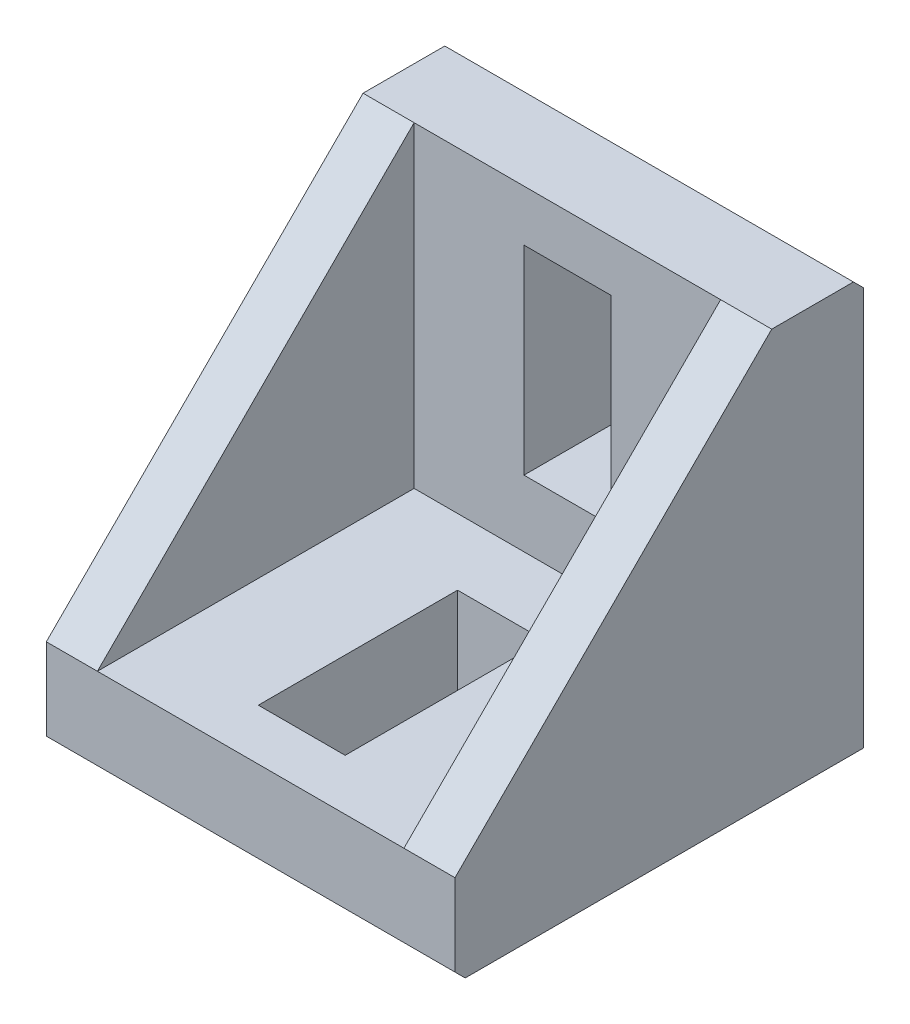
ISO-10303-21;
HEADER;
FILE_DESCRIPTION(('STEP AP214'),'2;1');
FILE_NAME('part.step','',(''),(''),'','','');
FILE_SCHEMA(('AUTOMOTIVE_DESIGN { 1 0 10303 214 1 1 1 1 }'));
ENDSEC;
DATA;
#1=APPLICATION_CONTEXT('core data for automotive mechanical design processes');
#2=APPLICATION_PROTOCOL_DEFINITION('international standard','automotive_design',2000,#1);
#3=PRODUCT_CONTEXT('',#1,'mechanical');
#4=PRODUCT('Part','Part','',(#3));
#5=PRODUCT_RELATED_PRODUCT_CATEGORY('part','',(#4));
#6=PRODUCT_DEFINITION_FORMATION('','',#4);
#7=PRODUCT_DEFINITION_CONTEXT('part definition',#1,'design');
#8=PRODUCT_DEFINITION('design','',#6,#7);
#9=PRODUCT_DEFINITION_SHAPE('','',#8);
#10=(LENGTH_UNIT() NAMED_UNIT(*) SI_UNIT(.MILLI.,.METRE.));
#11=(NAMED_UNIT(*) PLANE_ANGLE_UNIT() SI_UNIT($,.RADIAN.));
#12=(NAMED_UNIT(*) SI_UNIT($,.STERADIAN.) SOLID_ANGLE_UNIT());
#13=UNCERTAINTY_MEASURE_WITH_UNIT(LENGTH_MEASURE(1.E-05),#10,'distance_accuracy_value','');
#14=(GEOMETRIC_REPRESENTATION_CONTEXT(3) GLOBAL_UNCERTAINTY_ASSIGNED_CONTEXT((#13)) GLOBAL_UNIT_ASSIGNED_CONTEXT((#10,
#11,#12)) REPRESENTATION_CONTEXT('',''));
#15=CARTESIAN_POINT('',(0.,0.,0.));
#16=DIRECTION('',(0.,0.,1.));
#17=DIRECTION('',(1.,0.,0.));
#18=AXIS2_PLACEMENT_3D('',#15,#16,#17);
#19=CARTESIAN_POINT('',(0.,9.,0.));
#20=DIRECTION('',(0.,1.,0.));
#21=DIRECTION('',(0.,0.,1.));
#22=AXIS2_PLACEMENT_3D('',#19,#20,#21);
#23=PLANE('',#22);
#24=DIRECTION('',(0.,0.,-1.));
#25=VECTOR('',#24,1.);
#26=CARTESIAN_POINT('',(4.25,9.,-4.5));
#27=LINE('',#26,#25);
#28=CARTESIAN_POINT('',(4.25,9.,15.));
#29=VERTEX_POINT('',#28);
#30=CARTESIAN_POINT('',(4.25,9.,-4.5));
#31=VERTEX_POINT('',#30);
#32=EDGE_CURVE('E321',#29,#31,#27,.T.);
#33=ORIENTED_EDGE('',*,*,#32,.F.);
#34=DIRECTION('',(1.,0.,0.));
#35=VECTOR('',#34,1.);
#36=CARTESIAN_POINT('',(-4.25,9.,15.));
#37=LINE('',#36,#35);
#38=CARTESIAN_POINT('',(-4.25,9.,15.));
#39=VERTEX_POINT('',#38);
#40=EDGE_CURVE('E336',#39,#29,#37,.T.);
#41=ORIENTED_EDGE('',*,*,#40,.F.);
#42=DIRECTION('',(0.,0.,1.));
#43=VECTOR('',#42,1.);
#44=CARTESIAN_POINT('',(-4.25,9.,-4.5));
#45=LINE('',#44,#43);
#46=CARTESIAN_POINT('',(-4.25,9.,-4.5));
#47=VERTEX_POINT('',#46);
#48=EDGE_CURVE('E355',#47,#39,#45,.T.);
#49=ORIENTED_EDGE('',*,*,#48,.F.);
#50=DIRECTION('',(-1.,0.,0.));
#51=VECTOR('',#50,1.);
#52=CARTESIAN_POINT('',(-4.25,9.,-4.5));
#53=LINE('',#52,#51);
#54=EDGE_CURVE('E351',#31,#47,#53,.T.);
#55=ORIENTED_EDGE('',*,*,#54,.F.);
#56=EDGE_LOOP('',(#33,#41,#49,#55));
#57=FACE_BOUND('',#56,.T.);
#58=DIRECTION('',(1.,0.,0.));
#59=VECTOR('',#58,1.);
#60=CARTESIAN_POINT('',(-20.,9.,20.));
#61=LINE('',#60,#59);
#62=CARTESIAN_POINT('',(-15.,9.,20.));
#63=VERTEX_POINT('',#62);
#64=CARTESIAN_POINT('',(15.,9.,20.));
#65=VERTEX_POINT('',#64);
#66=EDGE_CURVE('E182',#63,#65,#61,.T.);
#67=ORIENTED_EDGE('',*,*,#66,.T.);
#68=DIRECTION('',(0.,0.,-1.));
#69=VECTOR('',#68,1.);
#70=CARTESIAN_POINT('',(15.,9.,-11.));
#71=LINE('',#70,#69);
#72=CARTESIAN_POINT('',(15.,9.,-11.));
#73=VERTEX_POINT('',#72);
#74=EDGE_CURVE('E167',#65,#73,#71,.T.);
#75=ORIENTED_EDGE('',*,*,#74,.T.);
#76=DIRECTION('',(1.,0.,0.));
#77=VECTOR('',#76,1.);
#78=CARTESIAN_POINT('',(-20.,9.,-11.));
#79=LINE('',#78,#77);
#80=CARTESIAN_POINT('',(-15.,9.,-11.));
#81=VERTEX_POINT('',#80);
#82=EDGE_CURVE('E180',#81,#73,#79,.T.);
#83=ORIENTED_EDGE('',*,*,#82,.F.);
#84=DIRECTION('',(0.,0.,1.));
#85=VECTOR('',#84,1.);
#86=CARTESIAN_POINT('',(-15.,9.,20.));
#87=LINE('',#86,#85);
#88=EDGE_CURVE('E277',#81,#63,#87,.T.);
#89=ORIENTED_EDGE('',*,*,#88,.T.);
#90=EDGE_LOOP('',(#67,#75,#83,#89));
#91=FACE_BOUND('',#90,.T.);
#92=ADVANCED_FACE('F39',(#57,#91),#23,.T.);
#93=CARTESIAN_POINT('',(-20.,40.,-11.));
#94=DIRECTION('',(0.,0.,-1.));
#95=DIRECTION('',(-1.,0.,0.));
#96=AXIS2_PLACEMENT_3D('',#93,#94,#95);
#97=PLANE('',#96);
#98=DIRECTION('',(-1.,0.,0.));
#99=VECTOR('',#98,1.);
#100=CARTESIAN_POINT('',(-4.25000000000001,35.,-11.));
#101=LINE('',#100,#99);
#102=CARTESIAN_POINT('',(4.24999999999999,35.,-11.));
#103=VERTEX_POINT('',#102);
#104=CARTESIAN_POINT('',(-4.25000000000001,35.,-11.));
#105=VERTEX_POINT('',#104);
#106=EDGE_CURVE('E307',#103,#105,#101,.T.);
#107=ORIENTED_EDGE('',*,*,#106,.F.);
#108=DIRECTION('',(0.,1.,0.));
#109=VECTOR('',#108,1.);
#110=CARTESIAN_POINT('',(4.25,15.5,-11.));
#111=LINE('',#110,#109);
#112=CARTESIAN_POINT('',(4.25,15.5,-11.));
#113=VERTEX_POINT('',#112);
#114=EDGE_CURVE('E283',#113,#103,#111,.T.);
#115=ORIENTED_EDGE('',*,*,#114,.F.);
#116=DIRECTION('',(1.,0.,0.));
#117=VECTOR('',#116,1.);
#118=CARTESIAN_POINT('',(-4.25,15.5,-11.));
#119=LINE('',#118,#117);
#120=CARTESIAN_POINT('',(-4.25,15.5,-11.));
#121=VERTEX_POINT('',#120);
#122=EDGE_CURVE('E292',#121,#113,#119,.T.);
#123=ORIENTED_EDGE('',*,*,#122,.F.);
#124=DIRECTION('',(0.,-1.,0.));
#125=VECTOR('',#124,1.);
#126=CARTESIAN_POINT('',(-4.25,15.5,-11.));
#127=LINE('',#126,#125);
#128=EDGE_CURVE('E311',#105,#121,#127,.T.);
#129=ORIENTED_EDGE('',*,*,#128,.F.);
#130=EDGE_LOOP('',(#107,#115,#123,#129));
#131=FACE_BOUND('',#130,.T.);
#132=DIRECTION('',(0.,1.,0.));
#133=VECTOR('',#132,1.);
#134=CARTESIAN_POINT('',(15.,40.,-11.));
#135=LINE('',#134,#133);
#136=CARTESIAN_POINT('',(15.,40.,-11.));
#137=VERTEX_POINT('',#136);
#138=EDGE_CURVE('E164',#73,#137,#135,.T.);
#139=ORIENTED_EDGE('',*,*,#138,.T.);
#140=DIRECTION('',(1.,0.,0.));
#141=VECTOR('',#140,1.);
#142=CARTESIAN_POINT('',(-20.,40.,-11.));
#143=LINE('',#142,#141);
#144=CARTESIAN_POINT('',(-15.,40.,-11.));
#145=VERTEX_POINT('',#144);
#146=EDGE_CURVE('E196',#145,#137,#143,.T.);
#147=ORIENTED_EDGE('',*,*,#146,.F.);
#148=DIRECTION('',(0.,-1.,0.));
#149=VECTOR('',#148,1.);
#150=CARTESIAN_POINT('',(-15.,9.,-11.));
#151=LINE('',#150,#149);
#152=EDGE_CURVE('E189',#145,#81,#151,.T.);
#153=ORIENTED_EDGE('',*,*,#152,.T.);
#154=ORIENTED_EDGE('',*,*,#82,.T.);
#155=EDGE_LOOP('',(#139,#147,#153,#154));
#156=FACE_BOUND('',#155,.T.);
#157=ADVANCED_FACE('F187',(#131,#156),#97,.F.);
#158=CARTESIAN_POINT('',(20.,9.,-20.));
#159=DIRECTION('',(-1.,0.,0.));
#160=DIRECTION('',(0.,0.,1.));
#161=AXIS2_PLACEMENT_3D('',#158,#159,#160);
#162=PLANE('',#161);
#163=DIRECTION('',(0.,-1.,0.));
#164=VECTOR('',#163,1.);
#165=CARTESIAN_POINT('',(20.,9.,-20.));
#166=LINE('',#165,#164);
#167=CARTESIAN_POINT('',(20.,39.,-20.));
#168=VERTEX_POINT('',#167);
#169=CARTESIAN_POINT('',(20.,0.,-20.));
#170=VERTEX_POINT('',#169);
#171=EDGE_CURVE('E228',#168,#170,#166,.T.);
#172=ORIENTED_EDGE('',*,*,#171,.F.);
#173=DIRECTION('',(0.,0.70710678118655,0.707106781186545));
#174=VECTOR('',#173,1.);
#175=CARTESIAN_POINT('',(20.,40.,-19.));
#176=LINE('',#175,#174);
#177=CARTESIAN_POINT('',(20.,40.,-19.));
#178=VERTEX_POINT('',#177);
#179=EDGE_CURVE('E247',#168,#178,#176,.T.);
#180=ORIENTED_EDGE('',*,*,#179,.T.);
#181=DIRECTION('',(0.,0.,-1.));
#182=VECTOR('',#181,1.);
#183=CARTESIAN_POINT('',(20.,40.,-20.));
#184=LINE('',#183,#182);
#185=CARTESIAN_POINT('',(20.,40.,-11.));
#186=VERTEX_POINT('',#185);
#187=EDGE_CURVE('E202',#186,#178,#184,.T.);
#188=ORIENTED_EDGE('',*,*,#187,.F.);
#189=DIRECTION('',(0.,-0.707106781186548,0.707106781186548));
#190=VECTOR('',#189,1.);
#191=CARTESIAN_POINT('',(20.,9.,20.));
#192=LINE('',#191,#190);
#193=CARTESIAN_POINT('',(20.,9.,20.));
#194=VERTEX_POINT('',#193);
#195=EDGE_CURVE('E184',#186,#194,#192,.T.);
#196=ORIENTED_EDGE('',*,*,#195,.T.);
#197=DIRECTION('',(0.,-1.,0.));
#198=VECTOR('',#197,1.);
#199=CARTESIAN_POINT('',(20.,9.,20.));
#200=LINE('',#199,#198);
#201=CARTESIAN_POINT('',(20.,1.,20.));
#202=VERTEX_POINT('',#201);
#203=EDGE_CURVE('E207',#194,#202,#200,.T.);
#204=ORIENTED_EDGE('',*,*,#203,.T.);
#205=DIRECTION('',(0.,0.707106781186545,0.70710678118655));
#206=VECTOR('',#205,1.);
#207=CARTESIAN_POINT('',(20.,1.,20.));
#208=LINE('',#207,#206);
#209=CARTESIAN_POINT('',(20.,0.,19.));
#210=VERTEX_POINT('',#209);
#211=EDGE_CURVE('E55',#202,#210,#208,.F.);
#212=ORIENTED_EDGE('',*,*,#211,.T.);
#213=DIRECTION('',(0.,0.,-1.));
#214=VECTOR('',#213,1.);
#215=CARTESIAN_POINT('',(20.,0.,-20.));
#216=LINE('',#215,#214);
#217=EDGE_CURVE('E208',#210,#170,#216,.T.);
#218=ORIENTED_EDGE('',*,*,#217,.T.);
#219=EDGE_LOOP('',(#172,#180,#188,#196,#204,#212,#218));
#220=FACE_BOUND('',#219,.T.);
#221=ADVANCED_FACE('F259',(#220),#162,.F.);
#222=CARTESIAN_POINT('',(-20.,9.,-20.));
#223=DIRECTION('',(0.,0.,1.));
#224=DIRECTION('',(1.,0.,0.));
#225=AXIS2_PLACEMENT_3D('',#222,#223,#224);
#226=PLANE('',#225);
#227=DIRECTION('',(1.,0.,0.));
#228=VECTOR('',#227,1.);
#229=CARTESIAN_POINT('',(-4.25,15.5,-20.));
#230=LINE('',#229,#228);
#231=CARTESIAN_POINT('',(-4.25,15.5,-20.));
#232=VERTEX_POINT('',#231);
#233=CARTESIAN_POINT('',(4.25,15.5,-20.));
#234=VERTEX_POINT('',#233);
#235=EDGE_CURVE('E300',#232,#234,#230,.T.);
#236=ORIENTED_EDGE('',*,*,#235,.T.);
#237=DIRECTION('',(0.,1.,0.));
#238=VECTOR('',#237,1.);
#239=CARTESIAN_POINT('',(4.25,15.5,-20.));
#240=LINE('',#239,#238);
#241=CARTESIAN_POINT('',(4.24999999999999,35.,-20.));
#242=VERTEX_POINT('',#241);
#243=EDGE_CURVE('E287',#234,#242,#240,.T.);
#244=ORIENTED_EDGE('',*,*,#243,.T.);
#245=DIRECTION('',(-1.,0.,0.));
#246=VECTOR('',#245,1.);
#247=CARTESIAN_POINT('',(-4.25000000000001,35.,-20.));
#248=LINE('',#247,#246);
#249=CARTESIAN_POINT('',(-4.25000000000001,35.,-20.));
#250=VERTEX_POINT('',#249);
#251=EDGE_CURVE('E291',#242,#250,#248,.T.);
#252=ORIENTED_EDGE('',*,*,#251,.T.);
#253=DIRECTION('',(0.,-1.,0.));
#254=VECTOR('',#253,1.);
#255=CARTESIAN_POINT('',(-4.25,15.5,-20.));
#256=LINE('',#255,#254);
#257=EDGE_CURVE('E296',#250,#232,#256,.T.);
#258=ORIENTED_EDGE('',*,*,#257,.T.);
#259=EDGE_LOOP('',(#236,#244,#252,#258));
#260=FACE_BOUND('',#259,.T.);
#261=DIRECTION('',(0.,-1.,0.));
#262=VECTOR('',#261,1.);
#263=CARTESIAN_POINT('',(-20.,9.,-20.));
#264=LINE('',#263,#262);
#265=CARTESIAN_POINT('',(-20.,39.,-20.));
#266=VERTEX_POINT('',#265);
#267=CARTESIAN_POINT('',(-20.,0.,-20.));
#268=VERTEX_POINT('',#267);
#269=EDGE_CURVE('E225',#266,#268,#264,.T.);
#270=ORIENTED_EDGE('',*,*,#269,.F.);
#271=DIRECTION('',(1.,0.,0.));
#272=VECTOR('',#271,1.);
#273=CARTESIAN_POINT('',(20.,39.,-20.));
#274=LINE('',#273,#272);
#275=EDGE_CURVE('E242',#266,#168,#274,.T.);
#276=ORIENTED_EDGE('',*,*,#275,.T.);
#277=ORIENTED_EDGE('',*,*,#171,.T.);
#278=DIRECTION('',(-1.,0.,0.));
#279=VECTOR('',#278,1.);
#280=CARTESIAN_POINT('',(-20.,0.,-20.));
#281=LINE('',#280,#279);
#282=EDGE_CURVE('E211',#170,#268,#281,.T.);
#283=ORIENTED_EDGE('',*,*,#282,.T.);
#284=EDGE_LOOP('',(#270,#276,#277,#283));
#285=FACE_BOUND('',#284,.T.);
#286=ADVANCED_FACE('F415',(#260,#285),#226,.F.);
#287=CARTESIAN_POINT('',(-20.,9.,-20.));
#288=DIRECTION('',(1.,0.,0.));
#289=DIRECTION('',(0.,0.,-1.));
#290=AXIS2_PLACEMENT_3D('',#287,#288,#289);
#291=PLANE('',#290);
#292=DIRECTION('',(0.,0.,1.));
#293=VECTOR('',#292,1.);
#294=CARTESIAN_POINT('',(-20.,40.,-20.));
#295=LINE('',#294,#293);
#296=CARTESIAN_POINT('',(-20.,40.,-19.));
#297=VERTEX_POINT('',#296);
#298=CARTESIAN_POINT('',(-20.,40.,-11.));
#299=VERTEX_POINT('',#298);
#300=EDGE_CURVE('E191',#297,#299,#295,.T.);
#301=ORIENTED_EDGE('',*,*,#300,.F.);
#302=DIRECTION('',(0.,-0.70710678118655,-0.707106781186545));
#303=VECTOR('',#302,1.);
#304=CARTESIAN_POINT('',(-20.,40.,-19.));
#305=LINE('',#304,#303);
#306=EDGE_CURVE('E239',#297,#266,#305,.T.);
#307=ORIENTED_EDGE('',*,*,#306,.T.);
#308=ORIENTED_EDGE('',*,*,#269,.T.);
#309=DIRECTION('',(0.,0.,1.));
#310=VECTOR('',#309,1.);
#311=CARTESIAN_POINT('',(-20.,0.,-20.));
#312=LINE('',#311,#310);
#313=CARTESIAN_POINT('',(-20.,0.,19.));
#314=VERTEX_POINT('',#313);
#315=EDGE_CURVE('E215',#268,#314,#312,.T.);
#316=ORIENTED_EDGE('',*,*,#315,.T.);
#317=DIRECTION('',(0.,-0.707106781186545,-0.70710678118655));
#318=VECTOR('',#317,1.);
#319=CARTESIAN_POINT('',(-20.,1.,20.));
#320=LINE('',#319,#318);
#321=CARTESIAN_POINT('',(-20.,1.,20.));
#322=VERTEX_POINT('',#321);
#323=EDGE_CURVE('E236',#314,#322,#320,.F.);
#324=ORIENTED_EDGE('',*,*,#323,.T.);
#325=DIRECTION('',(0.,-1.,0.));
#326=VECTOR('',#325,1.);
#327=CARTESIAN_POINT('',(-20.,9.,20.));
#328=LINE('',#327,#326);
#329=CARTESIAN_POINT('',(-20.,9.,20.));
#330=VERTEX_POINT('',#329);
#331=EDGE_CURVE('E221',#330,#322,#328,.T.);
#332=ORIENTED_EDGE('',*,*,#331,.F.);
#333=DIRECTION('',(0.,0.707106781186548,-0.707106781186548));
#334=VECTOR('',#333,1.);
#335=CARTESIAN_POINT('',(-20.,40.,-11.));
#336=LINE('',#335,#334);
#337=EDGE_CURVE('E271',#330,#299,#336,.T.);
#338=ORIENTED_EDGE('',*,*,#337,.T.);
#339=EDGE_LOOP('',(#301,#307,#308,#316,#324,#332,#338));
#340=FACE_BOUND('',#339,.T.);
#341=ADVANCED_FACE('F412',(#340),#291,.F.);
#342=CARTESIAN_POINT('',(-20.,9.,20.));
#343=DIRECTION('',(0.,0.,-1.));
#344=DIRECTION('',(-1.,0.,0.));
#345=AXIS2_PLACEMENT_3D('',#342,#343,#344);
#346=PLANE('',#345);
#347=ORIENTED_EDGE('',*,*,#331,.T.);
#348=DIRECTION('',(1.,0.,0.));
#349=VECTOR('',#348,1.);
#350=CARTESIAN_POINT('',(-20.,1.,20.));
#351=LINE('',#350,#349);
#352=EDGE_CURVE('E48',#322,#202,#351,.T.);
#353=ORIENTED_EDGE('',*,*,#352,.T.);
#354=ORIENTED_EDGE('',*,*,#203,.F.);
#355=DIRECTION('',(1.,0.,0.));
#356=VECTOR('',#355,1.);
#357=CARTESIAN_POINT('',(15.,9.,20.));
#358=LINE('',#357,#356);
#359=EDGE_CURVE('E268',#65,#194,#358,.T.);
#360=ORIENTED_EDGE('',*,*,#359,.F.);
#361=ORIENTED_EDGE('',*,*,#66,.F.);
#362=EDGE_CURVE('E204',#330,#63,#61,.T.);
#363=ORIENTED_EDGE('',*,*,#362,.F.);
#364=EDGE_LOOP('',(#347,#353,#354,#360,#361,#363));
#365=FACE_BOUND('',#364,.T.);
#366=ADVANCED_FACE('F252',(#365),#346,.F.);
#367=CARTESIAN_POINT('',(0.,0.,0.));
#368=DIRECTION('',(0.,1.,0.));
#369=DIRECTION('',(0.,0.,1.));
#370=AXIS2_PLACEMENT_3D('',#367,#368,#369);
#371=PLANE('',#370);
#372=DIRECTION('',(1.,0.,0.));
#373=VECTOR('',#372,1.);
#374=CARTESIAN_POINT('',(-4.25,0.,15.));
#375=LINE('',#374,#373);
#376=CARTESIAN_POINT('',(-4.25,0.,15.));
#377=VERTEX_POINT('',#376);
#378=CARTESIAN_POINT('',(4.25,0.,15.));
#379=VERTEX_POINT('',#378);
#380=EDGE_CURVE('E344',#377,#379,#375,.T.);
#381=ORIENTED_EDGE('',*,*,#380,.T.);
#382=DIRECTION('',(0.,0.,-1.));
#383=VECTOR('',#382,1.);
#384=CARTESIAN_POINT('',(4.25,0.,-4.5));
#385=LINE('',#384,#383);
#386=CARTESIAN_POINT('',(4.25,0.,-4.5));
#387=VERTEX_POINT('',#386);
#388=EDGE_CURVE('E331',#379,#387,#385,.T.);
#389=ORIENTED_EDGE('',*,*,#388,.T.);
#390=DIRECTION('',(-1.,0.,0.));
#391=VECTOR('',#390,1.);
#392=CARTESIAN_POINT('',(-4.25,0.,-4.5));
#393=LINE('',#392,#391);
#394=CARTESIAN_POINT('',(-4.25,0.,-4.5));
#395=VERTEX_POINT('',#394);
#396=EDGE_CURVE('E335',#387,#395,#393,.T.);
#397=ORIENTED_EDGE('',*,*,#396,.T.);
#398=DIRECTION('',(0.,0.,1.));
#399=VECTOR('',#398,1.);
#400=CARTESIAN_POINT('',(-4.25,0.,-4.5));
#401=LINE('',#400,#399);
#402=EDGE_CURVE('E340',#395,#377,#401,.T.);
#403=ORIENTED_EDGE('',*,*,#402,.T.);
#404=EDGE_LOOP('',(#381,#389,#397,#403));
#405=FACE_BOUND('',#404,.T.);
#406=ORIENTED_EDGE('',*,*,#217,.F.);
#407=DIRECTION('',(-1.,0.,0.));
#408=VECTOR('',#407,1.);
#409=CARTESIAN_POINT('',(0.,0.,19.));
#410=LINE('',#409,#408);
#411=EDGE_CURVE('E11',#210,#314,#410,.T.);
#412=ORIENTED_EDGE('',*,*,#411,.T.);
#413=ORIENTED_EDGE('',*,*,#315,.F.);
#414=ORIENTED_EDGE('',*,*,#282,.F.);
#415=EDGE_LOOP('',(#406,#412,#413,#414));
#416=FACE_BOUND('',#415,.T.);
#417=ADVANCED_FACE('F406',(#405,#416),#371,.F.);
#418=CARTESIAN_POINT('',(0.,40.,0.));
#419=DIRECTION('',(0.,1.,0.));
#420=DIRECTION('',(0.,0.,1.));
#421=AXIS2_PLACEMENT_3D('',#418,#419,#420);
#422=PLANE('',#421);
#423=ORIENTED_EDGE('',*,*,#187,.T.);
#424=DIRECTION('',(-1.,0.,0.));
#425=VECTOR('',#424,1.);
#426=CARTESIAN_POINT('',(-20.,40.,-19.));
#427=LINE('',#426,#425);
#428=EDGE_CURVE('E232',#178,#297,#427,.T.);
#429=ORIENTED_EDGE('',*,*,#428,.T.);
#430=ORIENTED_EDGE('',*,*,#300,.T.);
#431=EDGE_CURVE('E369',#299,#145,#143,.T.);
#432=ORIENTED_EDGE('',*,*,#431,.T.);
#433=ORIENTED_EDGE('',*,*,#146,.T.);
#434=DIRECTION('',(1.,0.,0.));
#435=VECTOR('',#434,1.);
#436=CARTESIAN_POINT('',(15.,40.,-11.));
#437=LINE('',#436,#435);
#438=EDGE_CURVE('E272',#137,#186,#437,.T.);
#439=ORIENTED_EDGE('',*,*,#438,.T.);
#440=EDGE_LOOP('',(#423,#429,#430,#432,#433,#439));
#441=FACE_BOUND('',#440,.T.);
#442=ADVANCED_FACE('F376',(#441),#422,.T.);
#443=CARTESIAN_POINT('',(4.25,0.,-4.5));
#444=DIRECTION('',(1.,0.,0.));
#445=DIRECTION('',(0.,0.,-1.));
#446=AXIS2_PLACEMENT_3D('',#443,#444,#445);
#447=PLANE('',#446);
#448=ORIENTED_EDGE('',*,*,#32,.T.);
#449=DIRECTION('',(0.,1.,0.));
#450=VECTOR('',#449,1.);
#451=CARTESIAN_POINT('',(4.25,0.,-4.5));
#452=LINE('',#451,#450);
#453=EDGE_CURVE('E348',#387,#31,#452,.T.);
#454=ORIENTED_EDGE('',*,*,#453,.F.);
#455=ORIENTED_EDGE('',*,*,#388,.F.);
#456=DIRECTION('',(0.,1.,0.));
#457=VECTOR('',#456,1.);
#458=CARTESIAN_POINT('',(4.25,0.,15.));
#459=LINE('',#458,#457);
#460=EDGE_CURVE('E192',#379,#29,#459,.T.);
#461=ORIENTED_EDGE('',*,*,#460,.T.);
#462=EDGE_LOOP('',(#448,#454,#455,#461));
#463=FACE_BOUND('',#462,.T.);
#464=ADVANCED_FACE('F535',(#463),#447,.F.);
#465=CARTESIAN_POINT('',(-4.25,0.,15.));
#466=DIRECTION('',(0.,0.,1.));
#467=DIRECTION('',(1.,0.,0.));
#468=AXIS2_PLACEMENT_3D('',#465,#466,#467);
#469=PLANE('',#468);
#470=ORIENTED_EDGE('',*,*,#40,.T.);
#471=ORIENTED_EDGE('',*,*,#460,.F.);
#472=ORIENTED_EDGE('',*,*,#380,.F.);
#473=DIRECTION('',(0.,1.,0.));
#474=VECTOR('',#473,1.);
#475=CARTESIAN_POINT('',(-4.25,0.,15.));
#476=LINE('',#475,#474);
#477=EDGE_CURVE('E198',#377,#39,#476,.T.);
#478=ORIENTED_EDGE('',*,*,#477,.T.);
#479=EDGE_LOOP('',(#470,#471,#472,#478));
#480=FACE_BOUND('',#479,.T.);
#481=ADVANCED_FACE('F525',(#480),#469,.F.);
#482=CARTESIAN_POINT('',(-4.25,0.,-4.5));
#483=DIRECTION('',(-1.,0.,0.));
#484=DIRECTION('',(0.,0.,1.));
#485=AXIS2_PLACEMENT_3D('',#482,#483,#484);
#486=PLANE('',#485);
#487=ORIENTED_EDGE('',*,*,#48,.T.);
#488=ORIENTED_EDGE('',*,*,#477,.F.);
#489=ORIENTED_EDGE('',*,*,#402,.F.);
#490=DIRECTION('',(0.,1.,0.));
#491=VECTOR('',#490,1.);
#492=CARTESIAN_POINT('',(-4.25,0.,-4.5));
#493=LINE('',#492,#491);
#494=EDGE_CURVE('E364',#395,#47,#493,.T.);
#495=ORIENTED_EDGE('',*,*,#494,.T.);
#496=EDGE_LOOP('',(#487,#488,#489,#495));
#497=FACE_BOUND('',#496,.T.);
#498=ADVANCED_FACE('F515',(#497),#486,.F.);
#499=CARTESIAN_POINT('',(-4.25,0.,-4.5));
#500=DIRECTION('',(0.,0.,-1.));
#501=DIRECTION('',(-1.,0.,0.));
#502=AXIS2_PLACEMENT_3D('',#499,#500,#501);
#503=PLANE('',#502);
#504=ORIENTED_EDGE('',*,*,#54,.T.);
#505=ORIENTED_EDGE('',*,*,#494,.F.);
#506=ORIENTED_EDGE('',*,*,#396,.F.);
#507=ORIENTED_EDGE('',*,*,#453,.T.);
#508=EDGE_LOOP('',(#504,#505,#506,#507));
#509=FACE_BOUND('',#508,.T.);
#510=ADVANCED_FACE('F505',(#509),#503,.F.);
#511=CARTESIAN_POINT('',(4.25,15.5,-20.));
#512=DIRECTION('',(1.,0.,0.));
#513=DIRECTION('',(0.,1.,0.));
#514=AXIS2_PLACEMENT_3D('',#511,#512,#513);
#515=PLANE('',#514);
#516=ORIENTED_EDGE('',*,*,#114,.T.);
#517=DIRECTION('',(0.,0.,1.));
#518=VECTOR('',#517,1.);
#519=CARTESIAN_POINT('',(4.24999999999999,35.,-20.));
#520=LINE('',#519,#518);
#521=EDGE_CURVE('E304',#242,#103,#520,.T.);
#522=ORIENTED_EDGE('',*,*,#521,.F.);
#523=ORIENTED_EDGE('',*,*,#243,.F.);
#524=DIRECTION('',(0.,0.,1.));
#525=VECTOR('',#524,1.);
#526=CARTESIAN_POINT('',(4.25,15.5,-20.));
#527=LINE('',#526,#525);
#528=EDGE_CURVE('E318',#234,#113,#527,.T.);
#529=ORIENTED_EDGE('',*,*,#528,.T.);
#530=EDGE_LOOP('',(#516,#522,#523,#529));
#531=FACE_BOUND('',#530,.T.);
#532=ADVANCED_FACE('F495',(#531),#515,.F.);
#533=CARTESIAN_POINT('',(-4.25,15.5,-20.));
#534=DIRECTION('',(0.,-1.,0.));
#535=DIRECTION('',(0.,0.,-1.));
#536=AXIS2_PLACEMENT_3D('',#533,#534,#535);
#537=PLANE('',#536);
#538=ORIENTED_EDGE('',*,*,#122,.T.);
#539=ORIENTED_EDGE('',*,*,#528,.F.);
#540=ORIENTED_EDGE('',*,*,#235,.F.);
#541=DIRECTION('',(0.,0.,1.));
#542=VECTOR('',#541,1.);
#543=CARTESIAN_POINT('',(-4.25,15.5,-20.));
#544=LINE('',#543,#542);
#545=EDGE_CURVE('E322',#232,#121,#544,.T.);
#546=ORIENTED_EDGE('',*,*,#545,.T.);
#547=EDGE_LOOP('',(#538,#539,#540,#546));
#548=FACE_BOUND('',#547,.T.);
#549=ADVANCED_FACE('F485',(#548),#537,.F.);
#550=CARTESIAN_POINT('',(-4.25,15.5,-20.));
#551=DIRECTION('',(-1.,0.,0.));
#552=DIRECTION('',(0.,-1.,0.));
#553=AXIS2_PLACEMENT_3D('',#550,#551,#552);
#554=PLANE('',#553);
#555=ORIENTED_EDGE('',*,*,#128,.T.);
#556=ORIENTED_EDGE('',*,*,#545,.F.);
#557=ORIENTED_EDGE('',*,*,#257,.F.);
#558=DIRECTION('',(0.,0.,1.));
#559=VECTOR('',#558,1.);
#560=CARTESIAN_POINT('',(-4.25000000000001,35.,-20.));
#561=LINE('',#560,#559);
#562=EDGE_CURVE('E325',#250,#105,#561,.T.);
#563=ORIENTED_EDGE('',*,*,#562,.T.);
#564=EDGE_LOOP('',(#555,#556,#557,#563));
#565=FACE_BOUND('',#564,.T.);
#566=ADVANCED_FACE('F475',(#565),#554,.F.);
#567=CARTESIAN_POINT('',(-4.25000000000001,35.,-20.));
#568=DIRECTION('',(0.,1.,0.));
#569=DIRECTION('',(0.,0.,1.));
#570=AXIS2_PLACEMENT_3D('',#567,#568,#569);
#571=PLANE('',#570);
#572=ORIENTED_EDGE('',*,*,#106,.T.);
#573=ORIENTED_EDGE('',*,*,#562,.F.);
#574=ORIENTED_EDGE('',*,*,#251,.F.);
#575=ORIENTED_EDGE('',*,*,#521,.T.);
#576=EDGE_LOOP('',(#572,#573,#574,#575));
#577=FACE_BOUND('',#576,.T.);
#578=ADVANCED_FACE('F393',(#577),#571,.F.);
#579=CARTESIAN_POINT('',(-15.,40.,-11.));
#580=DIRECTION('',(0.,0.707106781186548,0.707106781186548));
#581=DIRECTION('',(0.,-0.707106781186548,0.707106781186548));
#582=AXIS2_PLACEMENT_3D('',#579,#580,#581);
#583=PLANE('',#582);
#584=ORIENTED_EDGE('',*,*,#337,.F.);
#585=ORIENTED_EDGE('',*,*,#362,.T.);
#586=DIRECTION('',(0.,0.707106781186548,-0.707106781186548));
#587=VECTOR('',#586,1.);
#588=CARTESIAN_POINT('',(-15.,40.,-11.));
#589=LINE('',#588,#587);
#590=EDGE_CURVE('E280',#63,#145,#589,.T.);
#591=ORIENTED_EDGE('',*,*,#590,.T.);
#592=ORIENTED_EDGE('',*,*,#431,.F.);
#593=EDGE_LOOP('',(#584,#585,#591,#592));
#594=FACE_BOUND('',#593,.T.);
#595=ADVANCED_FACE('F383',(#594),#583,.T.);
#596=CARTESIAN_POINT('',(-15.,0.,0.));
#597=DIRECTION('',(-1.,0.,0.));
#598=DIRECTION('',(0.,0.,1.));
#599=AXIS2_PLACEMENT_3D('',#596,#597,#598);
#600=PLANE('',#599);
#601=ORIENTED_EDGE('',*,*,#152,.F.);
#602=ORIENTED_EDGE('',*,*,#590,.F.);
#603=ORIENTED_EDGE('',*,*,#88,.F.);
#604=EDGE_LOOP('',(#601,#602,#603));
#605=FACE_BOUND('',#604,.T.);
#606=ADVANCED_FACE('F385',(#605),#600,.F.);
#607=CARTESIAN_POINT('',(15.,9.,20.));
#608=DIRECTION('',(0.,0.707106781186548,0.707106781186548));
#609=DIRECTION('',(0.,-0.707106781186548,0.707106781186548));
#610=AXIS2_PLACEMENT_3D('',#607,#608,#609);
#611=PLANE('',#610);
#612=ORIENTED_EDGE('',*,*,#195,.F.);
#613=ORIENTED_EDGE('',*,*,#438,.F.);
#614=DIRECTION('',(0.,-0.707106781186548,0.707106781186548));
#615=VECTOR('',#614,1.);
#616=CARTESIAN_POINT('',(15.,9.,20.));
#617=LINE('',#616,#615);
#618=EDGE_CURVE('E169',#137,#65,#617,.T.);
#619=ORIENTED_EDGE('',*,*,#618,.T.);
#620=ORIENTED_EDGE('',*,*,#359,.T.);
#621=EDGE_LOOP('',(#612,#613,#619,#620));
#622=FACE_BOUND('',#621,.T.);
#623=ADVANCED_FACE('F378',(#622),#611,.T.);
#624=CARTESIAN_POINT('',(15.,0.,0.));
#625=DIRECTION('',(1.,0.,0.));
#626=DIRECTION('',(0.,0.,-1.));
#627=AXIS2_PLACEMENT_3D('',#624,#625,#626);
#628=PLANE('',#627);
#629=ORIENTED_EDGE('',*,*,#74,.F.);
#630=ORIENTED_EDGE('',*,*,#618,.F.);
#631=ORIENTED_EDGE('',*,*,#138,.F.);
#632=EDGE_LOOP('',(#629,#630,#631));
#633=FACE_BOUND('',#632,.T.);
#634=ADVANCED_FACE('F166',(#633),#628,.F.);
#635=CARTESIAN_POINT('',(0.,40.,-19.));
#636=DIRECTION('',(0.,0.707106781186545,-0.70710678118655));
#637=DIRECTION('',(1.,0.,0.));
#638=AXIS2_PLACEMENT_3D('',#635,#636,#637);
#639=PLANE('',#638);
#640=ORIENTED_EDGE('',*,*,#179,.F.);
#641=ORIENTED_EDGE('',*,*,#275,.F.);
#642=ORIENTED_EDGE('',*,*,#306,.F.);
#643=ORIENTED_EDGE('',*,*,#428,.F.);
#644=EDGE_LOOP('',(#640,#641,#642,#643));
#645=FACE_BOUND('',#644,.T.);
#646=ADVANCED_FACE('F421',(#645),#639,.T.);
#647=CARTESIAN_POINT('',(-20.,1.,20.));
#648=DIRECTION('',(0.,0.70710678118655,-0.707106781186545));
#649=DIRECTION('',(1.,0.,0.));
#650=AXIS2_PLACEMENT_3D('',#647,#648,#649);
#651=PLANE('',#650);
#652=ORIENTED_EDGE('',*,*,#323,.F.);
#653=ORIENTED_EDGE('',*,*,#411,.F.);
#654=ORIENTED_EDGE('',*,*,#211,.F.);
#655=ORIENTED_EDGE('',*,*,#352,.F.);
#656=EDGE_LOOP('',(#652,#653,#654,#655));
#657=FACE_BOUND('',#656,.T.);
#658=ADVANCED_FACE('F41',(#657),#651,.F.);
#659=CLOSED_SHELL('',(#92,#157,#221,#286,#341,#366,#417,#442,#464,#481,#498,#510,#532,#549,#566,
#578,#595,#606,#623,#634,#646,#658));
#660=MANIFOLD_SOLID_BREP('B2',#659);
#661=ADVANCED_BREP_SHAPE_REPRESENTATION('',(#18,#660),#14);
#662=SHAPE_DEFINITION_REPRESENTATION(#9,#661);
ENDSEC;
END-ISO-10303-21;
